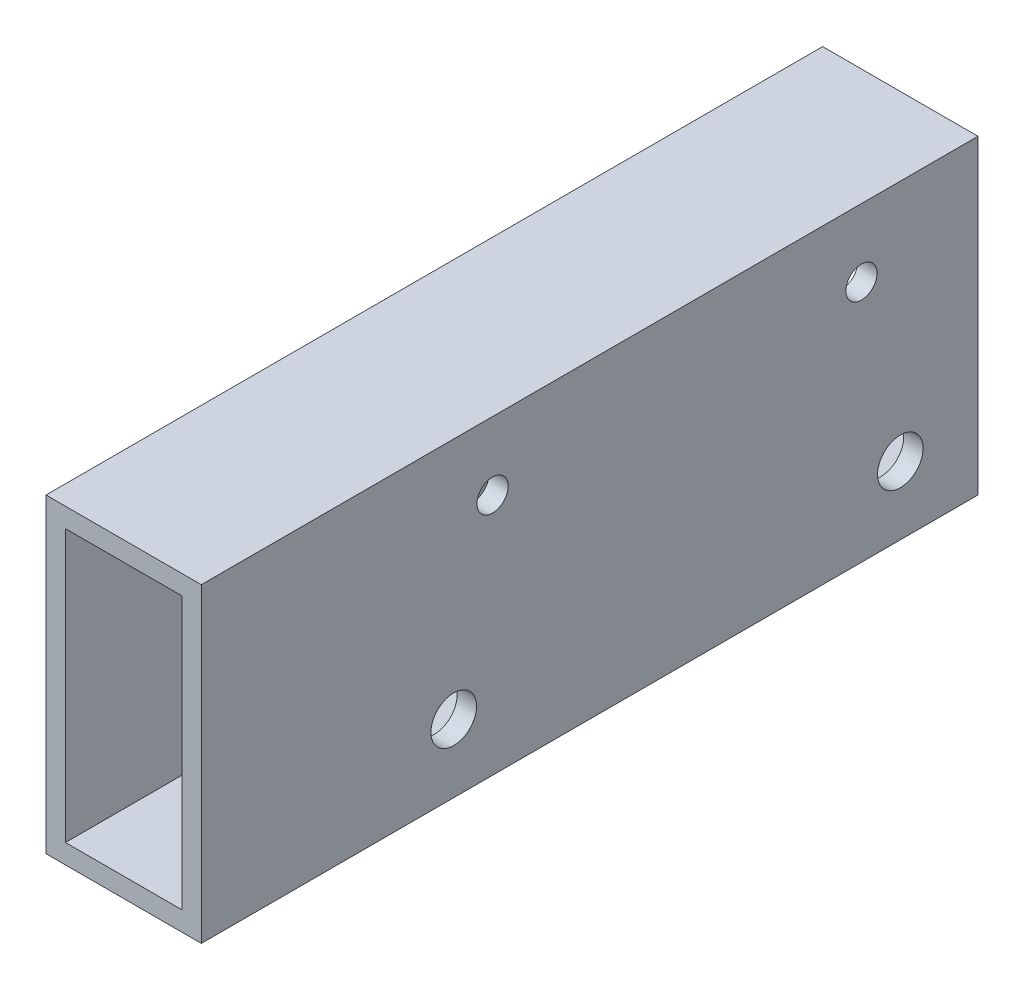
ISO-10303-21;
HEADER;
FILE_DESCRIPTION(('STEP AP214'),'2;1');
FILE_NAME('part.step','',(''),(''),'','','');
FILE_SCHEMA(('AUTOMOTIVE_DESIGN { 1 0 10303 214 1 1 1 1 }'));
ENDSEC;
DATA;
#1=APPLICATION_CONTEXT('core data for automotive mechanical design processes');
#2=APPLICATION_PROTOCOL_DEFINITION('international standard','automotive_design',2000,#1);
#3=PRODUCT_CONTEXT('',#1,'mechanical');
#4=PRODUCT('Part','Part','',(#3));
#5=PRODUCT_RELATED_PRODUCT_CATEGORY('part','',(#4));
#6=PRODUCT_DEFINITION_FORMATION('','',#4);
#7=PRODUCT_DEFINITION_CONTEXT('part definition',#1,'design');
#8=PRODUCT_DEFINITION('design','',#6,#7);
#9=PRODUCT_DEFINITION_SHAPE('','',#8);
#10=(LENGTH_UNIT() NAMED_UNIT(*) SI_UNIT(.MILLI.,.METRE.));
#11=(NAMED_UNIT(*) PLANE_ANGLE_UNIT() SI_UNIT($,.RADIAN.));
#12=(NAMED_UNIT(*) SI_UNIT($,.STERADIAN.) SOLID_ANGLE_UNIT());
#13=UNCERTAINTY_MEASURE_WITH_UNIT(LENGTH_MEASURE(1.E-05),#10,'distance_accuracy_value','');
#14=(GEOMETRIC_REPRESENTATION_CONTEXT(3) GLOBAL_UNCERTAINTY_ASSIGNED_CONTEXT((#13)) GLOBAL_UNIT_ASSIGNED_CONTEXT((#10,
#11,#12)) REPRESENTATION_CONTEXT('',''));
#15=CARTESIAN_POINT('',(0.,0.,0.));
#16=DIRECTION('',(0.,0.,1.));
#17=DIRECTION('',(1.,0.,0.));
#18=AXIS2_PLACEMENT_3D('',#15,#16,#17);
#19=CARTESIAN_POINT('',(0.,0.,63.5));
#20=DIRECTION('',(0.,0.,1.));
#21=DIRECTION('',(1.,0.,0.));
#22=AXIS2_PLACEMENT_3D('',#19,#20,#21);
#23=PLANE('',#22);
#24=DIRECTION('',(0.,1.,0.));
#25=VECTOR('',#24,1.);
#26=CARTESIAN_POINT('',(12.7,25.4,63.5));
#27=LINE('',#26,#25);
#28=CARTESIAN_POINT('',(12.7,-25.4,63.5));
#29=VERTEX_POINT('',#28);
#30=CARTESIAN_POINT('',(12.7,25.4,63.5));
#31=VERTEX_POINT('',#30);
#32=EDGE_CURVE('E137',#29,#31,#27,.T.);
#33=ORIENTED_EDGE('',*,*,#32,.T.);
#34=DIRECTION('',(-1.,0.,0.));
#35=VECTOR('',#34,1.);
#36=CARTESIAN_POINT('',(-12.7,25.4,63.5));
#37=LINE('',#36,#35);
#38=CARTESIAN_POINT('',(-12.7,25.4,63.5));
#39=VERTEX_POINT('',#38);
#40=EDGE_CURVE('E140',#31,#39,#37,.T.);
#41=ORIENTED_EDGE('',*,*,#40,.T.);
#42=DIRECTION('',(0.,-1.,0.));
#43=VECTOR('',#42,1.);
#44=CARTESIAN_POINT('',(-12.7,25.4,63.5));
#45=LINE('',#44,#43);
#46=CARTESIAN_POINT('',(-12.7,-25.4,63.5));
#47=VERTEX_POINT('',#46);
#48=EDGE_CURVE('E143',#39,#47,#45,.T.);
#49=ORIENTED_EDGE('',*,*,#48,.T.);
#50=DIRECTION('',(1.,0.,0.));
#51=VECTOR('',#50,1.);
#52=CARTESIAN_POINT('',(-12.7,-25.4,63.5));
#53=LINE('',#52,#51);
#54=EDGE_CURVE('E145',#47,#29,#53,.T.);
#55=ORIENTED_EDGE('',*,*,#54,.T.);
#56=EDGE_LOOP('',(#33,#41,#49,#55));
#57=FACE_BOUND('',#56,.T.);
#58=DIRECTION('',(1.,0.,0.));
#59=VECTOR('',#58,1.);
#60=CARTESIAN_POINT('',(-9.525,-22.225,63.5));
#61=LINE('',#60,#59);
#62=CARTESIAN_POINT('',(-9.525,-22.225,63.5));
#63=VERTEX_POINT('',#62);
#64=CARTESIAN_POINT('',(9.52500000000001,-22.225,63.5));
#65=VERTEX_POINT('',#64);
#66=EDGE_CURVE('E107',#63,#65,#61,.T.);
#67=ORIENTED_EDGE('',*,*,#66,.F.);
#68=DIRECTION('',(0.,-1.,0.));
#69=VECTOR('',#68,1.);
#70=CARTESIAN_POINT('',(-9.525,22.225,63.5));
#71=LINE('',#70,#69);
#72=CARTESIAN_POINT('',(-9.525,22.225,63.5));
#73=VERTEX_POINT('',#72);
#74=EDGE_CURVE('E99',#73,#63,#71,.T.);
#75=ORIENTED_EDGE('',*,*,#74,.F.);
#76=DIRECTION('',(-1.,0.,0.));
#77=VECTOR('',#76,1.);
#78=CARTESIAN_POINT('',(-9.525,22.225,63.5));
#79=LINE('',#78,#77);
#80=CARTESIAN_POINT('',(9.525,22.225,63.5));
#81=VERTEX_POINT('',#80);
#82=EDGE_CURVE('E121',#81,#73,#79,.T.);
#83=ORIENTED_EDGE('',*,*,#82,.F.);
#84=DIRECTION('',(0.,1.,0.));
#85=VECTOR('',#84,1.);
#86=CARTESIAN_POINT('',(9.525,22.225,63.5));
#87=LINE('',#86,#85);
#88=EDGE_CURVE('E119',#65,#81,#87,.T.);
#89=ORIENTED_EDGE('',*,*,#88,.F.);
#90=EDGE_LOOP('',(#67,#75,#83,#89));
#91=FACE_BOUND('',#90,.T.);
#92=ADVANCED_FACE('F32',(#57,#91),#23,.T.);
#93=CARTESIAN_POINT('',(0.,0.,-63.5));
#94=DIRECTION('',(0.,0.,1.));
#95=DIRECTION('',(1.,0.,0.));
#96=AXIS2_PLACEMENT_3D('',#93,#94,#95);
#97=PLANE('',#96);
#98=DIRECTION('',(0.,1.,0.));
#99=VECTOR('',#98,1.);
#100=CARTESIAN_POINT('',(12.7,25.4,-63.5));
#101=LINE('',#100,#99);
#102=CARTESIAN_POINT('',(12.7,-25.4,-63.5));
#103=VERTEX_POINT('',#102);
#104=CARTESIAN_POINT('',(12.7,25.4,-63.5));
#105=VERTEX_POINT('',#104);
#106=EDGE_CURVE('E115',#103,#105,#101,.T.);
#107=ORIENTED_EDGE('',*,*,#106,.F.);
#108=DIRECTION('',(1.,0.,0.));
#109=VECTOR('',#108,1.);
#110=CARTESIAN_POINT('',(-12.7,-25.4,-63.5));
#111=LINE('',#110,#109);
#112=CARTESIAN_POINT('',(-12.7,-25.4,-63.5));
#113=VERTEX_POINT('',#112);
#114=EDGE_CURVE('E141',#113,#103,#111,.T.);
#115=ORIENTED_EDGE('',*,*,#114,.F.);
#116=DIRECTION('',(0.,-1.,0.));
#117=VECTOR('',#116,1.);
#118=CARTESIAN_POINT('',(-12.7,25.4,-63.5));
#119=LINE('',#118,#117);
#120=CARTESIAN_POINT('',(-12.7,25.4,-63.5));
#121=VERTEX_POINT('',#120);
#122=EDGE_CURVE('E152',#121,#113,#119,.T.);
#123=ORIENTED_EDGE('',*,*,#122,.F.);
#124=DIRECTION('',(-1.,0.,0.));
#125=VECTOR('',#124,1.);
#126=CARTESIAN_POINT('',(-12.7,25.4,-63.5));
#127=LINE('',#126,#125);
#128=EDGE_CURVE('E150',#105,#121,#127,.T.);
#129=ORIENTED_EDGE('',*,*,#128,.F.);
#130=EDGE_LOOP('',(#107,#115,#123,#129));
#131=FACE_BOUND('',#130,.T.);
#132=DIRECTION('',(0.,-1.,0.));
#133=VECTOR('',#132,1.);
#134=CARTESIAN_POINT('',(-9.525,22.225,-63.5));
#135=LINE('',#134,#133);
#136=CARTESIAN_POINT('',(-9.525,22.225,-63.5));
#137=VERTEX_POINT('',#136);
#138=CARTESIAN_POINT('',(-9.525,-22.225,-63.5));
#139=VERTEX_POINT('',#138);
#140=EDGE_CURVE('E57',#137,#139,#135,.T.);
#141=ORIENTED_EDGE('',*,*,#140,.T.);
#142=DIRECTION('',(1.,0.,0.));
#143=VECTOR('',#142,1.);
#144=CARTESIAN_POINT('',(-9.525,-22.225,-63.5));
#145=LINE('',#144,#143);
#146=CARTESIAN_POINT('',(9.52500000000001,-22.225,-63.5));
#147=VERTEX_POINT('',#146);
#148=EDGE_CURVE('E114',#139,#147,#145,.T.);
#149=ORIENTED_EDGE('',*,*,#148,.T.);
#150=DIRECTION('',(0.,1.,0.));
#151=VECTOR('',#150,1.);
#152=CARTESIAN_POINT('',(9.525,22.225,-63.5));
#153=LINE('',#152,#151);
#154=CARTESIAN_POINT('',(9.525,22.225,-63.5));
#155=VERTEX_POINT('',#154);
#156=EDGE_CURVE('E129',#147,#155,#153,.T.);
#157=ORIENTED_EDGE('',*,*,#156,.T.);
#158=DIRECTION('',(-1.,0.,0.));
#159=VECTOR('',#158,1.);
#160=CARTESIAN_POINT('',(-9.525,22.225,-63.5));
#161=LINE('',#160,#159);
#162=EDGE_CURVE('E108',#155,#137,#161,.T.);
#163=ORIENTED_EDGE('',*,*,#162,.T.);
#164=EDGE_LOOP('',(#141,#149,#157,#163));
#165=FACE_BOUND('',#164,.T.);
#166=ADVANCED_FACE('F223',(#131,#165),#97,.F.);
#167=CARTESIAN_POINT('',(12.7,25.4,63.5));
#168=DIRECTION('',(-1.,0.,0.));
#169=DIRECTION('',(0.,-1.,0.));
#170=AXIS2_PLACEMENT_3D('',#167,#168,#169);
#171=PLANE('',#170);
#172=CARTESIAN_POINT('',(12.7,14.2875,15.875));
#173=DIRECTION('',(1.,0.,0.));
#174=DIRECTION('',(0.,1.,0.));
#175=AXIS2_PLACEMENT_3D('',#172,#173,#174);
#176=CIRCLE('',#175,2.5527);
#177=CARTESIAN_POINT('',(12.7,16.8402,15.875));
#178=VERTEX_POINT('',#177);
#179=EDGE_CURVE('E291',#178,#178,#176,.T.);
#180=ORIENTED_EDGE('',*,*,#179,.F.);
#181=EDGE_LOOP('',(#180));
#182=FACE_BOUND('',#181,.T.);
#183=CARTESIAN_POINT('',(12.7,14.2875,-44.45));
#184=DIRECTION('',(1.,0.,0.));
#185=DIRECTION('',(0.,1.,0.));
#186=AXIS2_PLACEMENT_3D('',#183,#184,#185);
#187=CIRCLE('',#186,2.5527);
#188=CARTESIAN_POINT('',(12.7,16.8402,-44.45));
#189=VERTEX_POINT('',#188);
#190=EDGE_CURVE('E180',#189,#189,#187,.T.);
#191=ORIENTED_EDGE('',*,*,#190,.F.);
#192=EDGE_LOOP('',(#191));
#193=FACE_BOUND('',#192,.T.);
#194=CARTESIAN_POINT('',(12.7,-14.2875,22.225));
#195=DIRECTION('',(1.,0.,0.));
#196=DIRECTION('',(0.,1.,0.));
#197=AXIS2_PLACEMENT_3D('',#194,#195,#196);
#198=CIRCLE('',#197,3.72872);
#199=CARTESIAN_POINT('',(12.7,-10.55878,22.225));
#200=VERTEX_POINT('',#199);
#201=EDGE_CURVE('E177',#200,#200,#198,.T.);
#202=ORIENTED_EDGE('',*,*,#201,.F.);
#203=EDGE_LOOP('',(#202));
#204=FACE_BOUND('',#203,.T.);
#205=CARTESIAN_POINT('',(12.7,-14.2875,-50.8));
#206=DIRECTION('',(1.,0.,0.));
#207=DIRECTION('',(0.,1.,0.));
#208=AXIS2_PLACEMENT_3D('',#205,#206,#207);
#209=CIRCLE('',#208,3.72872);
#210=CARTESIAN_POINT('',(12.7,-10.55878,-50.8));
#211=VERTEX_POINT('',#210);
#212=EDGE_CURVE('E196',#211,#211,#209,.T.);
#213=ORIENTED_EDGE('',*,*,#212,.F.);
#214=EDGE_LOOP('',(#213));
#215=FACE_BOUND('',#214,.T.);
#216=ORIENTED_EDGE('',*,*,#106,.T.);
#217=DIRECTION('',(0.,0.,-1.));
#218=VECTOR('',#217,1.);
#219=CARTESIAN_POINT('',(12.7,25.4,63.5));
#220=LINE('',#219,#218);
#221=EDGE_CURVE('E11',#31,#105,#220,.T.);
#222=ORIENTED_EDGE('',*,*,#221,.F.);
#223=ORIENTED_EDGE('',*,*,#32,.F.);
#224=DIRECTION('',(0.,0.,-1.));
#225=VECTOR('',#224,1.);
#226=CARTESIAN_POINT('',(12.7,-25.4,63.5));
#227=LINE('',#226,#225);
#228=EDGE_CURVE('E147',#29,#103,#227,.T.);
#229=ORIENTED_EDGE('',*,*,#228,.T.);
#230=EDGE_LOOP('',(#216,#222,#223,#229));
#231=FACE_BOUND('',#230,.T.);
#232=ADVANCED_FACE('F34',(#182,#193,#204,#215,#231),#171,.F.);
#233=CARTESIAN_POINT('',(-12.7,25.4,63.5));
#234=DIRECTION('',(0.,-1.,0.));
#235=DIRECTION('',(0.,0.,-1.));
#236=AXIS2_PLACEMENT_3D('',#233,#234,#235);
#237=PLANE('',#236);
#238=ORIENTED_EDGE('',*,*,#128,.T.);
#239=DIRECTION('',(0.,0.,-1.));
#240=VECTOR('',#239,1.);
#241=CARTESIAN_POINT('',(-12.7,25.4,63.5));
#242=LINE('',#241,#240);
#243=EDGE_CURVE('E41',#39,#121,#242,.T.);
#244=ORIENTED_EDGE('',*,*,#243,.F.);
#245=ORIENTED_EDGE('',*,*,#40,.F.);
#246=ORIENTED_EDGE('',*,*,#221,.T.);
#247=EDGE_LOOP('',(#238,#244,#245,#246));
#248=FACE_BOUND('',#247,.T.);
#249=ADVANCED_FACE('F232',(#248),#237,.F.);
#250=CARTESIAN_POINT('',(-12.7,25.4,63.5));
#251=DIRECTION('',(1.,0.,0.));
#252=DIRECTION('',(0.,1.,0.));
#253=AXIS2_PLACEMENT_3D('',#250,#251,#252);
#254=PLANE('',#253);
#255=CARTESIAN_POINT('',(-12.7,14.2875,15.875));
#256=DIRECTION('',(1.,0.,0.));
#257=DIRECTION('',(0.,1.,0.));
#258=AXIS2_PLACEMENT_3D('',#255,#256,#257);
#259=CIRCLE('',#258,2.5527);
#260=CARTESIAN_POINT('',(-12.7,16.8402,15.875));
#261=VERTEX_POINT('',#260);
#262=EDGE_CURVE('E292',#261,#261,#259,.T.);
#263=ORIENTED_EDGE('',*,*,#262,.T.);
#264=EDGE_LOOP('',(#263));
#265=FACE_BOUND('',#264,.T.);
#266=CARTESIAN_POINT('',(-12.7,14.2875,-44.45));
#267=DIRECTION('',(1.,0.,0.));
#268=DIRECTION('',(0.,1.,0.));
#269=AXIS2_PLACEMENT_3D('',#266,#267,#268);
#270=CIRCLE('',#269,2.5527);
#271=CARTESIAN_POINT('',(-12.7,16.8402,-44.45));
#272=VERTEX_POINT('',#271);
#273=EDGE_CURVE('E173',#272,#272,#270,.T.);
#274=ORIENTED_EDGE('',*,*,#273,.T.);
#275=EDGE_LOOP('',(#274));
#276=FACE_BOUND('',#275,.T.);
#277=CARTESIAN_POINT('',(-12.7,-14.2875,22.225));
#278=DIRECTION('',(1.,0.,0.));
#279=DIRECTION('',(0.,1.,0.));
#280=AXIS2_PLACEMENT_3D('',#277,#278,#279);
#281=CIRCLE('',#280,3.72872);
#282=CARTESIAN_POINT('',(-12.7,-10.55878,22.225));
#283=VERTEX_POINT('',#282);
#284=EDGE_CURVE('E169',#283,#283,#281,.T.);
#285=ORIENTED_EDGE('',*,*,#284,.T.);
#286=EDGE_LOOP('',(#285));
#287=FACE_BOUND('',#286,.T.);
#288=CARTESIAN_POINT('',(-12.7,-14.2875,-50.8));
#289=DIRECTION('',(1.,0.,0.));
#290=DIRECTION('',(0.,1.,0.));
#291=AXIS2_PLACEMENT_3D('',#288,#289,#290);
#292=CIRCLE('',#291,3.72872);
#293=CARTESIAN_POINT('',(-12.7,-10.55878,-50.8));
#294=VERTEX_POINT('',#293);
#295=EDGE_CURVE('E165',#294,#294,#292,.T.);
#296=ORIENTED_EDGE('',*,*,#295,.T.);
#297=EDGE_LOOP('',(#296));
#298=FACE_BOUND('',#297,.T.);
#299=ORIENTED_EDGE('',*,*,#122,.T.);
#300=DIRECTION('',(0.,0.,-1.));
#301=VECTOR('',#300,1.);
#302=CARTESIAN_POINT('',(-12.7,-25.4,63.5));
#303=LINE('',#302,#301);
#304=EDGE_CURVE('E157',#47,#113,#303,.T.);
#305=ORIENTED_EDGE('',*,*,#304,.F.);
#306=ORIENTED_EDGE('',*,*,#48,.F.);
#307=ORIENTED_EDGE('',*,*,#243,.T.);
#308=EDGE_LOOP('',(#299,#305,#306,#307));
#309=FACE_BOUND('',#308,.T.);
#310=ADVANCED_FACE('F216',(#265,#276,#287,#298,#309),#254,.F.);
#311=CARTESIAN_POINT('',(-12.7,-25.4,63.5));
#312=DIRECTION('',(0.,1.,0.));
#313=DIRECTION('',(0.,0.,1.));
#314=AXIS2_PLACEMENT_3D('',#311,#312,#313);
#315=PLANE('',#314);
#316=ORIENTED_EDGE('',*,*,#114,.T.);
#317=ORIENTED_EDGE('',*,*,#228,.F.);
#318=ORIENTED_EDGE('',*,*,#54,.F.);
#319=ORIENTED_EDGE('',*,*,#304,.T.);
#320=EDGE_LOOP('',(#316,#317,#318,#319));
#321=FACE_BOUND('',#320,.T.);
#322=ADVANCED_FACE('F207',(#321),#315,.F.);
#323=CARTESIAN_POINT('',(-9.525,22.225,63.5));
#324=DIRECTION('',(1.,0.,0.));
#325=DIRECTION('',(0.,1.,0.));
#326=AXIS2_PLACEMENT_3D('',#323,#324,#325);
#327=PLANE('',#326);
#328=CARTESIAN_POINT('',(-9.525,14.2875,15.875));
#329=DIRECTION('',(1.,0.,0.));
#330=DIRECTION('',(0.,1.,0.));
#331=AXIS2_PLACEMENT_3D('',#328,#329,#330);
#332=CIRCLE('',#331,2.5527);
#333=CARTESIAN_POINT('',(-9.525,16.8402,15.875));
#334=VERTEX_POINT('',#333);
#335=EDGE_CURVE('E185',#334,#334,#332,.T.);
#336=ORIENTED_EDGE('',*,*,#335,.F.);
#337=EDGE_LOOP('',(#336));
#338=FACE_BOUND('',#337,.T.);
#339=CARTESIAN_POINT('',(-9.525,14.2875,-44.45));
#340=DIRECTION('',(1.,0.,0.));
#341=DIRECTION('',(0.,1.,0.));
#342=AXIS2_PLACEMENT_3D('',#339,#340,#341);
#343=CIRCLE('',#342,2.5527);
#344=CARTESIAN_POINT('',(-9.525,16.8402,-44.45));
#345=VERTEX_POINT('',#344);
#346=EDGE_CURVE('E172',#345,#345,#343,.T.);
#347=ORIENTED_EDGE('',*,*,#346,.F.);
#348=EDGE_LOOP('',(#347));
#349=FACE_BOUND('',#348,.T.);
#350=CARTESIAN_POINT('',(-9.525,-14.2875,22.225));
#351=DIRECTION('',(1.,0.,0.));
#352=DIRECTION('',(0.,1.,0.));
#353=AXIS2_PLACEMENT_3D('',#350,#351,#352);
#354=CIRCLE('',#353,3.72872);
#355=CARTESIAN_POINT('',(-9.525,-10.55878,22.225));
#356=VERTEX_POINT('',#355);
#357=EDGE_CURVE('E168',#356,#356,#354,.T.);
#358=ORIENTED_EDGE('',*,*,#357,.F.);
#359=EDGE_LOOP('',(#358));
#360=FACE_BOUND('',#359,.T.);
#361=CARTESIAN_POINT('',(-9.525,-14.2875,-50.8));
#362=DIRECTION('',(1.,0.,0.));
#363=DIRECTION('',(0.,1.,0.));
#364=AXIS2_PLACEMENT_3D('',#361,#362,#363);
#365=CIRCLE('',#364,3.72872);
#366=CARTESIAN_POINT('',(-9.525,-10.55878,-50.8));
#367=VERTEX_POINT('',#366);
#368=EDGE_CURVE('E127',#367,#367,#365,.T.);
#369=ORIENTED_EDGE('',*,*,#368,.F.);
#370=EDGE_LOOP('',(#369));
#371=FACE_BOUND('',#370,.T.);
#372=ORIENTED_EDGE('',*,*,#140,.F.);
#373=DIRECTION('',(0.,0.,-1.));
#374=VECTOR('',#373,1.);
#375=CARTESIAN_POINT('',(-9.525,22.225,63.5));
#376=LINE('',#375,#374);
#377=EDGE_CURVE('E103',#73,#137,#376,.T.);
#378=ORIENTED_EDGE('',*,*,#377,.F.);
#379=ORIENTED_EDGE('',*,*,#74,.T.);
#380=DIRECTION('',(0.,0.,-1.));
#381=VECTOR('',#380,1.);
#382=CARTESIAN_POINT('',(-9.525,-22.225,63.5));
#383=LINE('',#382,#381);
#384=EDGE_CURVE('E102',#63,#139,#383,.T.);
#385=ORIENTED_EDGE('',*,*,#384,.T.);
#386=EDGE_LOOP('',(#372,#378,#379,#385));
#387=FACE_BOUND('',#386,.T.);
#388=ADVANCED_FACE('F101',(#338,#349,#360,#371,#387),#327,.T.);
#389=CARTESIAN_POINT('',(-9.525,-22.225,63.5));
#390=DIRECTION('',(0.,1.,0.));
#391=DIRECTION('',(-1.,0.,0.));
#392=AXIS2_PLACEMENT_3D('',#389,#390,#391);
#393=PLANE('',#392);
#394=ORIENTED_EDGE('',*,*,#148,.F.);
#395=ORIENTED_EDGE('',*,*,#384,.F.);
#396=ORIENTED_EDGE('',*,*,#66,.T.);
#397=DIRECTION('',(0.,0.,-1.));
#398=VECTOR('',#397,1.);
#399=CARTESIAN_POINT('',(9.52500000000001,-22.225,63.5));
#400=LINE('',#399,#398);
#401=EDGE_CURVE('E116',#65,#147,#400,.T.);
#402=ORIENTED_EDGE('',*,*,#401,.T.);
#403=EDGE_LOOP('',(#394,#395,#396,#402));
#404=FACE_BOUND('',#403,.T.);
#405=ADVANCED_FACE('F111',(#404),#393,.T.);
#406=CARTESIAN_POINT('',(9.525,22.225,63.5));
#407=DIRECTION('',(-1.,0.,0.));
#408=DIRECTION('',(0.,-1.,0.));
#409=AXIS2_PLACEMENT_3D('',#406,#407,#408);
#410=PLANE('',#409);
#411=CARTESIAN_POINT('',(9.525,14.2875,15.875));
#412=DIRECTION('',(-1.,0.,0.));
#413=DIRECTION('',(0.,-1.,0.));
#414=AXIS2_PLACEMENT_3D('',#411,#412,#413);
#415=CIRCLE('',#414,2.5527);
#416=CARTESIAN_POINT('',(9.525,11.7348,15.875));
#417=VERTEX_POINT('',#416);
#418=EDGE_CURVE('E36',#417,#417,#415,.T.);
#419=ORIENTED_EDGE('',*,*,#418,.F.);
#420=EDGE_LOOP('',(#419));
#421=FACE_BOUND('',#420,.T.);
#422=CARTESIAN_POINT('',(9.525,14.2875,-44.45));
#423=DIRECTION('',(-1.,0.,0.));
#424=DIRECTION('',(0.,-1.,0.));
#425=AXIS2_PLACEMENT_3D('',#422,#423,#424);
#426=CIRCLE('',#425,2.5527);
#427=CARTESIAN_POINT('',(9.525,11.7348,-44.45));
#428=VERTEX_POINT('',#427);
#429=EDGE_CURVE('E170',#428,#428,#426,.T.);
#430=ORIENTED_EDGE('',*,*,#429,.F.);
#431=EDGE_LOOP('',(#430));
#432=FACE_BOUND('',#431,.T.);
#433=CARTESIAN_POINT('',(9.525,-14.2875,22.225));
#434=DIRECTION('',(-1.,0.,0.));
#435=DIRECTION('',(0.,-1.,0.));
#436=AXIS2_PLACEMENT_3D('',#433,#434,#435);
#437=CIRCLE('',#436,3.72872);
#438=CARTESIAN_POINT('',(9.525,-18.01622,22.225));
#439=VERTEX_POINT('',#438);
#440=EDGE_CURVE('E166',#439,#439,#437,.T.);
#441=ORIENTED_EDGE('',*,*,#440,.F.);
#442=EDGE_LOOP('',(#441));
#443=FACE_BOUND('',#442,.T.);
#444=CARTESIAN_POINT('',(9.525,-14.2875,-50.8));
#445=DIRECTION('',(-1.,0.,0.));
#446=DIRECTION('',(0.,-1.,0.));
#447=AXIS2_PLACEMENT_3D('',#444,#445,#446);
#448=CIRCLE('',#447,3.72872);
#449=CARTESIAN_POINT('',(9.525,-18.01622,-50.8));
#450=VERTEX_POINT('',#449);
#451=EDGE_CURVE('E162',#450,#450,#448,.T.);
#452=ORIENTED_EDGE('',*,*,#451,.F.);
#453=EDGE_LOOP('',(#452));
#454=FACE_BOUND('',#453,.T.);
#455=ORIENTED_EDGE('',*,*,#156,.F.);
#456=ORIENTED_EDGE('',*,*,#401,.F.);
#457=ORIENTED_EDGE('',*,*,#88,.T.);
#458=DIRECTION('',(0.,0.,-1.));
#459=VECTOR('',#458,1.);
#460=CARTESIAN_POINT('',(9.525,22.225,63.5));
#461=LINE('',#460,#459);
#462=EDGE_CURVE('E49',#81,#155,#461,.T.);
#463=ORIENTED_EDGE('',*,*,#462,.T.);
#464=EDGE_LOOP('',(#455,#456,#457,#463));
#465=FACE_BOUND('',#464,.T.);
#466=ADVANCED_FACE('F214',(#421,#432,#443,#454,#465),#410,.T.);
#467=CARTESIAN_POINT('',(-9.525,22.225,63.5));
#468=DIRECTION('',(0.,-1.,0.));
#469=DIRECTION('',(0.,0.,-1.));
#470=AXIS2_PLACEMENT_3D('',#467,#468,#469);
#471=PLANE('',#470);
#472=ORIENTED_EDGE('',*,*,#162,.F.);
#473=ORIENTED_EDGE('',*,*,#462,.F.);
#474=ORIENTED_EDGE('',*,*,#82,.T.);
#475=ORIENTED_EDGE('',*,*,#377,.T.);
#476=EDGE_LOOP('',(#472,#473,#474,#475));
#477=FACE_BOUND('',#476,.T.);
#478=ADVANCED_FACE('F254',(#477),#471,.T.);
#479=CARTESIAN_POINT('',(-12.7,-14.2875,-50.8));
#480=DIRECTION('',(1.,0.,0.));
#481=DIRECTION('',(0.,1.,0.));
#482=AXIS2_PLACEMENT_3D('',#479,#480,#481);
#483=CYLINDRICAL_SURFACE('',#482,3.72872);
#484=ORIENTED_EDGE('',*,*,#451,.T.);
#485=EDGE_LOOP('',(#484));
#486=FACE_BOUND('',#485,.T.);
#487=ORIENTED_EDGE('',*,*,#212,.T.);
#488=EDGE_LOOP('',(#487));
#489=FACE_BOUND('',#488,.T.);
#490=ADVANCED_FACE('F256',(#486,#489),#483,.F.);
#491=ORIENTED_EDGE('',*,*,#368,.T.);
#492=EDGE_LOOP('',(#491));
#493=FACE_BOUND('',#492,.T.);
#494=ORIENTED_EDGE('',*,*,#295,.F.);
#495=EDGE_LOOP('',(#494));
#496=FACE_BOUND('',#495,.T.);
#497=ADVANCED_FACE('F203',(#493,#496),#483,.F.);
#498=CARTESIAN_POINT('',(-12.7,-14.2875,22.225));
#499=DIRECTION('',(1.,0.,0.));
#500=DIRECTION('',(0.,1.,0.));
#501=AXIS2_PLACEMENT_3D('',#498,#499,#500);
#502=CYLINDRICAL_SURFACE('',#501,3.72872);
#503=ORIENTED_EDGE('',*,*,#440,.T.);
#504=EDGE_LOOP('',(#503));
#505=FACE_BOUND('',#504,.T.);
#506=ORIENTED_EDGE('',*,*,#201,.T.);
#507=EDGE_LOOP('',(#506));
#508=FACE_BOUND('',#507,.T.);
#509=ADVANCED_FACE('F267',(#505,#508),#502,.F.);
#510=ORIENTED_EDGE('',*,*,#357,.T.);
#511=EDGE_LOOP('',(#510));
#512=FACE_BOUND('',#511,.T.);
#513=ORIENTED_EDGE('',*,*,#284,.F.);
#514=EDGE_LOOP('',(#513));
#515=FACE_BOUND('',#514,.T.);
#516=ADVANCED_FACE('F270',(#512,#515),#502,.F.);
#517=CARTESIAN_POINT('',(-12.7,14.2875,-44.45));
#518=DIRECTION('',(1.,0.,0.));
#519=DIRECTION('',(0.,1.,0.));
#520=AXIS2_PLACEMENT_3D('',#517,#518,#519);
#521=CYLINDRICAL_SURFACE('',#520,2.5527);
#522=ORIENTED_EDGE('',*,*,#429,.T.);
#523=EDGE_LOOP('',(#522));
#524=FACE_BOUND('',#523,.T.);
#525=ORIENTED_EDGE('',*,*,#190,.T.);
#526=EDGE_LOOP('',(#525));
#527=FACE_BOUND('',#526,.T.);
#528=ADVANCED_FACE('F272',(#524,#527),#521,.F.);
#529=ORIENTED_EDGE('',*,*,#346,.T.);
#530=EDGE_LOOP('',(#529));
#531=FACE_BOUND('',#530,.T.);
#532=ORIENTED_EDGE('',*,*,#273,.F.);
#533=EDGE_LOOP('',(#532));
#534=FACE_BOUND('',#533,.T.);
#535=ADVANCED_FACE('F275',(#531,#534),#521,.F.);
#536=CARTESIAN_POINT('',(-12.7,14.2875,15.875));
#537=DIRECTION('',(1.,0.,0.));
#538=DIRECTION('',(0.,1.,0.));
#539=AXIS2_PLACEMENT_3D('',#536,#537,#538);
#540=CYLINDRICAL_SURFACE('',#539,2.5527);
#541=ORIENTED_EDGE('',*,*,#418,.T.);
#542=EDGE_LOOP('',(#541));
#543=FACE_BOUND('',#542,.T.);
#544=ORIENTED_EDGE('',*,*,#179,.T.);
#545=EDGE_LOOP('',(#544));
#546=FACE_BOUND('',#545,.T.);
#547=ADVANCED_FACE('F276',(#543,#546),#540,.F.);
#548=ORIENTED_EDGE('',*,*,#335,.T.);
#549=EDGE_LOOP('',(#548));
#550=FACE_BOUND('',#549,.T.);
#551=ORIENTED_EDGE('',*,*,#262,.F.);
#552=EDGE_LOOP('',(#551));
#553=FACE_BOUND('',#552,.T.);
#554=ADVANCED_FACE('F278',(#550,#553),#540,.F.);
#555=CLOSED_SHELL('',(#92,#166,#232,#249,#310,#322,#388,#405,#466,#478,#490,#497,#509,#516,#528,
#535,#547,#554));
#556=MANIFOLD_SOLID_BREP('B2',#555);
#557=ADVANCED_BREP_SHAPE_REPRESENTATION('',(#18,#556),#14);
#558=SHAPE_DEFINITION_REPRESENTATION(#9,#557);
ENDSEC;
END-ISO-10303-21;
